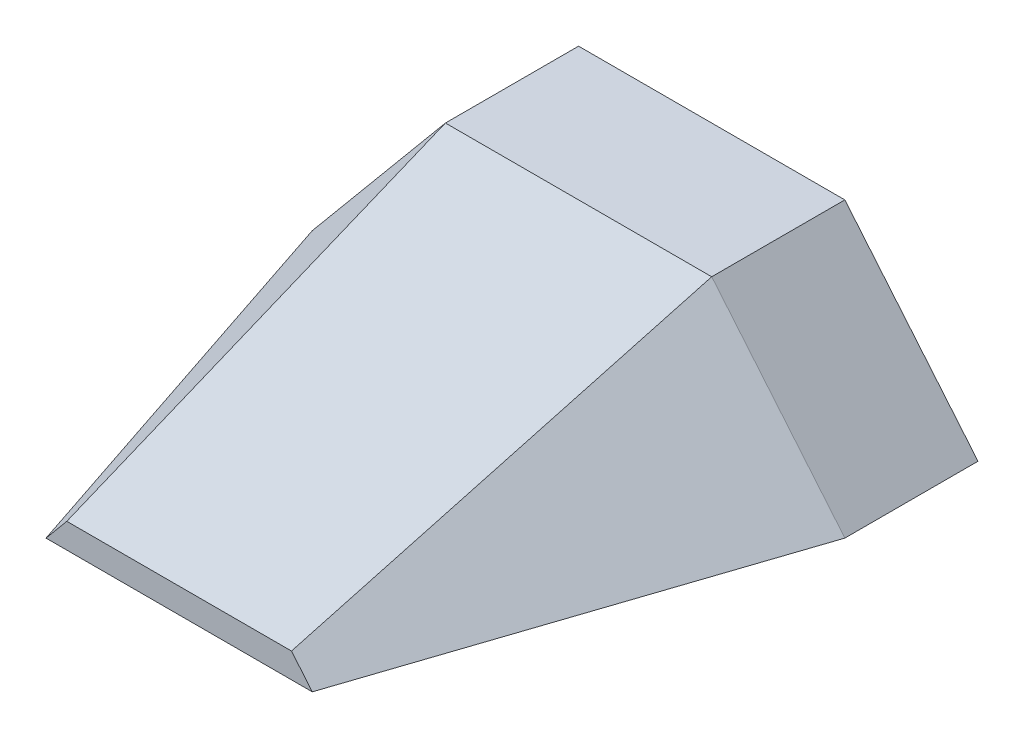
ISO-10303-21;
HEADER;
FILE_DESCRIPTION(('STEP AP214'),'2;1');
FILE_NAME('part.step','',(''),(''),'','','');
FILE_SCHEMA(('AUTOMOTIVE_DESIGN { 1 0 10303 214 1 1 1 1 }'));
ENDSEC;
DATA;
#1=APPLICATION_CONTEXT('core data for automotive mechanical design processes');
#2=APPLICATION_PROTOCOL_DEFINITION('international standard','automotive_design',2000,#1);
#3=PRODUCT_CONTEXT('',#1,'mechanical');
#4=PRODUCT('Part','Part','',(#3));
#5=PRODUCT_RELATED_PRODUCT_CATEGORY('part','',(#4));
#6=PRODUCT_DEFINITION_FORMATION('','',#4);
#7=PRODUCT_DEFINITION_CONTEXT('part definition',#1,'design');
#8=PRODUCT_DEFINITION('design','',#6,#7);
#9=PRODUCT_DEFINITION_SHAPE('','',#8);
#10=(LENGTH_UNIT() NAMED_UNIT(*) SI_UNIT(.MILLI.,.METRE.));
#11=(NAMED_UNIT(*) PLANE_ANGLE_UNIT() SI_UNIT($,.RADIAN.));
#12=(NAMED_UNIT(*) SI_UNIT($,.STERADIAN.) SOLID_ANGLE_UNIT());
#13=UNCERTAINTY_MEASURE_WITH_UNIT(LENGTH_MEASURE(1.E-05),#10,'distance_accuracy_value','');
#14=(GEOMETRIC_REPRESENTATION_CONTEXT(3) GLOBAL_UNCERTAINTY_ASSIGNED_CONTEXT((#13)) GLOBAL_UNIT_ASSIGNED_CONTEXT((#10,
#11,#12)) REPRESENTATION_CONTEXT('',''));
#15=CARTESIAN_POINT('',(0.,0.,0.));
#16=DIRECTION('',(0.,0.,1.));
#17=DIRECTION('',(1.,0.,0.));
#18=AXIS2_PLACEMENT_3D('',#15,#16,#17);
#19=CARTESIAN_POINT('',(16.,0.,8.));
#20=DIRECTION('',(0.,1.,0.));
#21=DIRECTION('',(-1.,0.,0.));
#22=AXIS2_PLACEMENT_3D('',#19,#20,#21);
#23=PLANE('',#22);
#24=DIRECTION('',(1.,0.,0.));
#25=VECTOR('',#24,1.);
#26=CARTESIAN_POINT('',(16.,0.,0.));
#27=LINE('',#26,#25);
#28=CARTESIAN_POINT('',(-16.,0.,0.));
#29=VERTEX_POINT('',#28);
#30=CARTESIAN_POINT('',(16.,0.,0.));
#31=VERTEX_POINT('',#30);
#32=EDGE_CURVE('E121',#29,#31,#27,.T.);
#33=ORIENTED_EDGE('',*,*,#32,.T.);
#34=DIRECTION('',(0.,0.,-1.));
#35=VECTOR('',#34,1.);
#36=CARTESIAN_POINT('',(16.,0.,8.));
#37=LINE('',#36,#35);
#38=CARTESIAN_POINT('',(16.,0.,8.));
#39=VERTEX_POINT('',#38);
#40=EDGE_CURVE('E59',#39,#31,#37,.T.);
#41=ORIENTED_EDGE('',*,*,#40,.F.);
#42=DIRECTION('',(-0.316227766016838,0.,0.948683298050514));
#43=VECTOR('',#42,1.);
#44=CARTESIAN_POINT('',(16.,0.,8.));
#45=LINE('',#44,#43);
#46=CARTESIAN_POINT('',(8.,0.,32.));
#47=VERTEX_POINT('',#46);
#48=EDGE_CURVE('E257',#39,#47,#45,.T.);
#49=ORIENTED_EDGE('',*,*,#48,.T.);
#50=DIRECTION('',(1.,0.,0.));
#51=VECTOR('',#50,1.);
#52=CARTESIAN_POINT('',(-8.,0.,32.));
#53=LINE('',#52,#51);
#54=CARTESIAN_POINT('',(-8.,0.,32.));
#55=VERTEX_POINT('',#54);
#56=EDGE_CURVE('E153',#55,#47,#53,.T.);
#57=ORIENTED_EDGE('',*,*,#56,.F.);
#58=DIRECTION('',(0.316227766016838,0.,0.948683298050514));
#59=VECTOR('',#58,1.);
#60=CARTESIAN_POINT('',(-16.,0.,8.));
#61=LINE('',#60,#59);
#62=CARTESIAN_POINT('',(-16.,0.,8.));
#63=VERTEX_POINT('',#62);
#64=EDGE_CURVE('E202',#63,#55,#61,.T.);
#65=ORIENTED_EDGE('',*,*,#64,.F.);
#66=DIRECTION('',(0.,0.,-1.));
#67=VECTOR('',#66,1.);
#68=CARTESIAN_POINT('',(-16.,0.,8.));
#69=LINE('',#68,#67);
#70=EDGE_CURVE('E12',#63,#29,#69,.T.);
#71=ORIENTED_EDGE('',*,*,#70,.T.);
#72=EDGE_LOOP('',(#33,#41,#49,#57,#65,#71));
#73=FACE_BOUND('',#72,.T.);
#74=DIRECTION('',(1.,0.,0.));
#75=VECTOR('',#74,1.);
#76=CARTESIAN_POINT('',(0.,0.,1.6));
#77=LINE('',#76,#75);
#78=CARTESIAN_POINT('',(-13.9172667530916,0.,1.6));
#79=VERTEX_POINT('',#78);
#80=CARTESIAN_POINT('',(13.9172667530916,0.,1.6));
#81=VERTEX_POINT('',#80);
#82=EDGE_CURVE('E490',#79,#81,#77,.T.);
#83=ORIENTED_EDGE('',*,*,#82,.F.);
#84=DIRECTION('',(0.,0.,-1.));
#85=VECTOR('',#84,1.);
#86=CARTESIAN_POINT('',(-13.9172667530916,0.,8.));
#87=LINE('',#86,#85);
#88=CARTESIAN_POINT('',(-13.9172667530916,0.,7.79839354208649));
#89=VERTEX_POINT('',#88);
#90=EDGE_CURVE('E483',#89,#79,#87,.T.);
#91=ORIENTED_EDGE('',*,*,#90,.F.);
#92=DIRECTION('',(0.316227766016838,0.,0.948683298050514));
#93=VECTOR('',#92,1.);
#94=CARTESIAN_POINT('',(-14.8650581404084,0.,4.95501938013611));
#95=LINE('',#94,#93);
#96=CARTESIAN_POINT('',(-6.38339793378706,0.,30.4));
#97=VERTEX_POINT('',#96);
#98=EDGE_CURVE('E67',#89,#97,#95,.T.);
#99=ORIENTED_EDGE('',*,*,#98,.T.);
#100=DIRECTION('',(1.,0.,0.));
#101=VECTOR('',#100,1.);
#102=CARTESIAN_POINT('',(16.,0.,30.4));
#103=LINE('',#102,#101);
#104=CARTESIAN_POINT('',(6.38339793378706,0.,30.4));
#105=VERTEX_POINT('',#104);
#106=EDGE_CURVE('E500',#97,#105,#103,.T.);
#107=ORIENTED_EDGE('',*,*,#106,.T.);
#108=DIRECTION('',(-0.316227766016838,0.,0.948683298050514));
#109=VECTOR('',#108,1.);
#110=CARTESIAN_POINT('',(14.0650581404084,0.,7.35501938013612));
#111=LINE('',#110,#109);
#112=CARTESIAN_POINT('',(13.9172667530916,0.,7.7983935420865));
#113=VERTEX_POINT('',#112);
#114=EDGE_CURVE('E458',#113,#105,#111,.T.);
#115=ORIENTED_EDGE('',*,*,#114,.F.);
#116=DIRECTION('',(0.,0.,-1.));
#117=VECTOR('',#116,1.);
#118=CARTESIAN_POINT('',(13.9172667530916,0.,8.));
#119=LINE('',#118,#117);
#120=EDGE_CURVE('E467',#113,#81,#119,.T.);
#121=ORIENTED_EDGE('',*,*,#120,.T.);
#122=EDGE_LOOP('',(#83,#91,#99,#107,#115,#121));
#123=FACE_BOUND('',#122,.T.);
#124=ADVANCED_FACE('F49',(#73,#123),#23,.F.);
#125=CARTESIAN_POINT('',(-16.,0.,8.));
#126=DIRECTION('',(0.768221279597376,-0.64018439966448,0.));
#127=DIRECTION('',(0.64018439966448,0.768221279597376,0.));
#128=AXIS2_PLACEMENT_3D('',#125,#126,#127);
#129=PLANE('',#128);
#130=DIRECTION('',(-0.64018439966448,-0.768221279597376,0.));
#131=VECTOR('',#130,1.);
#132=CARTESIAN_POINT('',(-16.,0.,0.));
#133=LINE('',#132,#131);
#134=CARTESIAN_POINT('',(-8.,9.6,0.));
#135=VERTEX_POINT('',#134);
#136=EDGE_CURVE('E131',#135,#29,#133,.T.);
#137=ORIENTED_EDGE('',*,*,#136,.T.);
#138=ORIENTED_EDGE('',*,*,#70,.F.);
#139=DIRECTION('',(0.64018439966448,0.768221279597376,0.));
#140=VECTOR('',#139,1.);
#141=CARTESIAN_POINT('',(-9.44262295081967,7.86885245901639,8.));
#142=LINE('',#141,#140);
#143=CARTESIAN_POINT('',(-8.,9.6,8.));
#144=VERTEX_POINT('',#143);
#145=EDGE_CURVE('E53',#144,#63,#142,.F.);
#146=ORIENTED_EDGE('',*,*,#145,.F.);
#147=DIRECTION('',(0.,0.,-1.));
#148=VECTOR('',#147,1.);
#149=CARTESIAN_POINT('',(-8.,9.6,8.));
#150=LINE('',#149,#148);
#151=EDGE_CURVE('E76',#144,#135,#150,.T.);
#152=ORIENTED_EDGE('',*,*,#151,.T.);
#153=EDGE_LOOP('',(#137,#138,#146,#152));
#154=FACE_BOUND('',#153,.T.);
#155=ADVANCED_FACE('F51',(#154),#129,.F.);
#156=CARTESIAN_POINT('',(8.,9.6,8.));
#157=DIRECTION('',(-0.768221279597375,-0.64018439966448,0.));
#158=DIRECTION('',(0.64018439966448,-0.768221279597375,0.));
#159=AXIS2_PLACEMENT_3D('',#156,#157,#158);
#160=PLANE('',#159);
#161=DIRECTION('',(-0.64018439966448,0.768221279597375,0.));
#162=VECTOR('',#161,1.);
#163=CARTESIAN_POINT('',(8.,9.6,0.));
#164=LINE('',#163,#162);
#165=CARTESIAN_POINT('',(8.,9.6,0.));
#166=VERTEX_POINT('',#165);
#167=EDGE_CURVE('E130',#31,#166,#164,.T.);
#168=ORIENTED_EDGE('',*,*,#167,.T.);
#169=DIRECTION('',(0.,0.,-1.));
#170=VECTOR('',#169,1.);
#171=CARTESIAN_POINT('',(8.,9.6,8.));
#172=LINE('',#171,#170);
#173=CARTESIAN_POINT('',(8.,9.6,8.));
#174=VERTEX_POINT('',#173);
#175=EDGE_CURVE('E135',#174,#166,#172,.T.);
#176=ORIENTED_EDGE('',*,*,#175,.F.);
#177=DIRECTION('',(0.64018439966448,-0.768221279597375,0.));
#178=VECTOR('',#177,1.);
#179=CARTESIAN_POINT('',(9.44262295081967,7.8688524590164,8.));
#180=LINE('',#179,#178);
#181=EDGE_CURVE('E103',#39,#174,#180,.F.);
#182=ORIENTED_EDGE('',*,*,#181,.F.);
#183=ORIENTED_EDGE('',*,*,#40,.T.);
#184=EDGE_LOOP('',(#168,#176,#182,#183));
#185=FACE_BOUND('',#184,.T.);
#186=ADVANCED_FACE('F133',(#185),#160,.F.);
#187=CARTESIAN_POINT('',(-8.,9.6,8.));
#188=DIRECTION('',(0.,-1.,0.));
#189=DIRECTION('',(1.,0.,0.));
#190=AXIS2_PLACEMENT_3D('',#187,#188,#189);
#191=PLANE('',#190);
#192=DIRECTION('',(-1.,0.,0.));
#193=VECTOR('',#192,1.);
#194=CARTESIAN_POINT('',(-8.,9.6,0.));
#195=LINE('',#194,#193);
#196=EDGE_CURVE('E91',#166,#135,#195,.T.);
#197=ORIENTED_EDGE('',*,*,#196,.T.);
#198=ORIENTED_EDGE('',*,*,#151,.F.);
#199=DIRECTION('',(1.,0.,0.));
#200=VECTOR('',#199,1.);
#201=CARTESIAN_POINT('',(0.,9.6,8.));
#202=LINE('',#201,#200);
#203=EDGE_CURVE('E146',#174,#144,#202,.F.);
#204=ORIENTED_EDGE('',*,*,#203,.F.);
#205=ORIENTED_EDGE('',*,*,#175,.T.);
#206=EDGE_LOOP('',(#197,#198,#204,#205));
#207=FACE_BOUND('',#206,.T.);
#208=ADVANCED_FACE('F168',(#207),#191,.F.);
#209=CARTESIAN_POINT('',(0.,0.,0.));
#210=DIRECTION('',(0.,0.,-1.));
#211=DIRECTION('',(-1.,0.,0.));
#212=AXIS2_PLACEMENT_3D('',#209,#210,#211);
#213=PLANE('',#212);
#214=ORIENTED_EDGE('',*,*,#136,.F.);
#215=ORIENTED_EDGE('',*,*,#196,.F.);
#216=ORIENTED_EDGE('',*,*,#167,.F.);
#217=ORIENTED_EDGE('',*,*,#32,.F.);
#218=EDGE_LOOP('',(#214,#215,#216,#217));
#219=FACE_BOUND('',#218,.T.);
#220=ADVANCED_FACE('F137',(#219),#213,.T.);
#221=CARTESIAN_POINT('',(0.,0.,32.));
#222=DIRECTION('',(0.,0.,1.));
#223=DIRECTION('',(1.,0.,0.));
#224=AXIS2_PLACEMENT_3D('',#221,#222,#223);
#225=PLANE('',#224);
#226=DIRECTION('',(-0.64018439966448,0.768221279597376,0.));
#227=VECTOR('',#226,1.);
#228=CARTESIAN_POINT('',(6.75,1.5,32.));
#229=LINE('',#228,#227);
#230=CARTESIAN_POINT('',(6.75,1.5,32.));
#231=VERTEX_POINT('',#230);
#232=EDGE_CURVE('E195',#47,#231,#229,.T.);
#233=ORIENTED_EDGE('',*,*,#232,.T.);
#234=DIRECTION('',(-1.,0.,0.));
#235=VECTOR('',#234,1.);
#236=CARTESIAN_POINT('',(-6.75,1.5,32.));
#237=LINE('',#236,#235);
#238=CARTESIAN_POINT('',(-6.75,1.5,32.));
#239=VERTEX_POINT('',#238);
#240=EDGE_CURVE('E198',#231,#239,#237,.T.);
#241=ORIENTED_EDGE('',*,*,#240,.T.);
#242=DIRECTION('',(-0.64018439966448,-0.768221279597376,0.));
#243=VECTOR('',#242,1.);
#244=CARTESIAN_POINT('',(-8.,0.,32.));
#245=LINE('',#244,#243);
#246=EDGE_CURVE('E203',#239,#55,#245,.T.);
#247=ORIENTED_EDGE('',*,*,#246,.T.);
#248=ORIENTED_EDGE('',*,*,#56,.T.);
#249=EDGE_LOOP('',(#233,#241,#247,#248));
#250=FACE_BOUND('',#249,.T.);
#251=ADVANCED_FACE('F173',(#250),#225,.T.);
#252=CARTESIAN_POINT('',(-10.3384615384615,8.61538461538461,3.44615384615384));
#253=DIRECTION('',(0.744208407535251,-0.620173672946042,-0.248069469178417));
#254=DIRECTION('',(0.64018439966448,0.768221279597376,0.));
#255=AXIS2_PLACEMENT_3D('',#252,#253,#254);
#256=PLANE('',#255);
#257=ORIENTED_EDGE('',*,*,#64,.T.);
#258=ORIENTED_EDGE('',*,*,#246,.F.);
#259=DIRECTION('',(0.0492885769488059,-0.319389978628261,0.946340677417071));
#260=VECTOR('',#259,1.);
#261=CARTESIAN_POINT('',(-8.,9.6,8.));
#262=LINE('',#261,#260);
#263=EDGE_CURVE('E260',#144,#239,#262,.T.);
#264=ORIENTED_EDGE('',*,*,#263,.F.);
#265=ORIENTED_EDGE('',*,*,#145,.T.);
#266=EDGE_LOOP('',(#257,#258,#264,#265));
#267=FACE_BOUND('',#266,.T.);
#268=ADVANCED_FACE('F224',(#267),#256,.F.);
#269=CARTESIAN_POINT('',(0.,11.0422219105064,3.7267498947959));
#270=DIRECTION('',(0.,-0.947492278987199,-0.31977864415818));
#271=DIRECTION('',(0.,0.31977864415818,-0.947492278987199));
#272=AXIS2_PLACEMENT_3D('',#269,#270,#271);
#273=PLANE('',#272);
#274=ORIENTED_EDGE('',*,*,#263,.T.);
#275=ORIENTED_EDGE('',*,*,#240,.F.);
#276=DIRECTION('',(-0.0492885769488056,-0.319389978628261,0.946340677417071));
#277=VECTOR('',#276,1.);
#278=CARTESIAN_POINT('',(8.,9.6,8.));
#279=LINE('',#278,#277);
#280=EDGE_CURVE('E113',#174,#231,#279,.T.);
#281=ORIENTED_EDGE('',*,*,#280,.F.);
#282=ORIENTED_EDGE('',*,*,#203,.T.);
#283=EDGE_LOOP('',(#274,#275,#281,#282));
#284=FACE_BOUND('',#283,.T.);
#285=ADVANCED_FACE('F179',(#284),#273,.F.);
#286=CARTESIAN_POINT('',(10.3384615384615,8.61538461538463,3.44615384615385));
#287=DIRECTION('',(-0.74420840753525,-0.620173672946043,-0.248069469178417));
#288=DIRECTION('',(0.64018439966448,-0.768221279597375,0.));
#289=AXIS2_PLACEMENT_3D('',#286,#287,#288);
#290=PLANE('',#289);
#291=ORIENTED_EDGE('',*,*,#280,.T.);
#292=ORIENTED_EDGE('',*,*,#232,.F.);
#293=ORIENTED_EDGE('',*,*,#48,.F.);
#294=ORIENTED_EDGE('',*,*,#181,.T.);
#295=EDGE_LOOP('',(#291,#292,#293,#294));
#296=FACE_BOUND('',#295,.T.);
#297=ADVANCED_FACE('F174',(#296),#290,.F.);
#298=CARTESIAN_POINT('',(-14.7708459526442,-1.02429503946317,8.));
#299=DIRECTION('',(0.768221279597376,-0.64018439966448,0.));
#300=DIRECTION('',(0.64018439966448,0.768221279597376,0.));
#301=AXIS2_PLACEMENT_3D('',#298,#299,#300);
#302=PLANE('',#301);
#303=DIRECTION('',(-0.64018439966448,-0.768221279597376,0.));
#304=VECTOR('',#303,1.);
#305=CARTESIAN_POINT('',(-8.21346890346388,6.84455741955322,1.6));
#306=LINE('',#305,#304);
#307=CARTESIAN_POINT('',(-7.2506000864249,7.99999999999999,1.6));
#308=VERTEX_POINT('',#307);
#309=EDGE_CURVE('E457',#308,#79,#306,.T.);
#310=ORIENTED_EDGE('',*,*,#309,.F.);
#311=DIRECTION('',(0.,0.,-1.));
#312=VECTOR('',#311,1.);
#313=CARTESIAN_POINT('',(-7.2506000864249,8.,8.));
#314=LINE('',#313,#312);
#315=CARTESIAN_POINT('',(-7.2506000864249,7.99999999999999,7.73727966155575));
#316=VERTEX_POINT('',#315);
#317=EDGE_CURVE('E522',#316,#308,#314,.T.);
#318=ORIENTED_EDGE('',*,*,#317,.F.);
#319=DIRECTION('',(-0.257496237323986,-0.308995484788783,0.915542177151951));
#320=VECTOR('',#319,1.);
#321=CARTESIAN_POINT('',(-5.58232207528539,10.0019336133674,1.80562451083749));
#322=LINE('',#321,#320);
#323=CARTESIAN_POINT('',(-7.26778836532417,7.97937406532087,7.79839354208649));
#324=VERTEX_POINT('',#323);
#325=EDGE_CURVE('E478',#316,#324,#322,.T.);
#326=ORIENTED_EDGE('',*,*,#325,.T.);
#327=DIRECTION('',(-0.64018439966448,-0.768221279597376,0.));
#328=VECTOR('',#327,1.);
#329=CARTESIAN_POINT('',(-8.21346890346387,6.84455741955322,7.79839354208649));
#330=LINE('',#329,#328);
#331=EDGE_CURVE('E471',#324,#89,#330,.T.);
#332=ORIENTED_EDGE('',*,*,#331,.T.);
#333=ORIENTED_EDGE('',*,*,#90,.T.);
#334=EDGE_LOOP('',(#310,#318,#326,#332,#333));
#335=FACE_BOUND('',#334,.T.);
#336=ADVANCED_FACE('F178',(#335),#302,.T.);
#337=CARTESIAN_POINT('',(6.7708459526442,8.57570496053683,8.));
#338=DIRECTION('',(-0.768221279597375,-0.64018439966448,0.));
#339=DIRECTION('',(0.64018439966448,-0.768221279597375,0.));
#340=AXIS2_PLACEMENT_3D('',#337,#338,#339);
#341=PLANE('',#340);
#342=DIRECTION('',(-0.64018439966448,0.768221279597376,0.));
#343=VECTOR('',#342,1.);
#344=CARTESIAN_POINT('',(8.21346890346387,6.84455741955323,1.6));
#345=LINE('',#344,#343);
#346=CARTESIAN_POINT('',(7.25060008642489,8.,1.6));
#347=VERTEX_POINT('',#346);
#348=EDGE_CURVE('E494',#81,#347,#345,.T.);
#349=ORIENTED_EDGE('',*,*,#348,.F.);
#350=ORIENTED_EDGE('',*,*,#120,.F.);
#351=DIRECTION('',(-0.64018439966448,0.768221279597375,0.));
#352=VECTOR('',#351,1.);
#353=CARTESIAN_POINT('',(8.21346890346386,6.84455741955323,7.7983935420865));
#354=LINE('',#353,#352);
#355=CARTESIAN_POINT('',(7.26778836532417,7.97937406532087,7.7983935420865));
#356=VERTEX_POINT('',#355);
#357=EDGE_CURVE('E446',#113,#356,#354,.T.);
#358=ORIENTED_EDGE('',*,*,#357,.T.);
#359=DIRECTION('',(0.257496237323986,-0.308995484788783,0.915542177151951));
#360=VECTOR('',#359,1.);
#361=CARTESIAN_POINT('',(7.23492022203893,8.01881583726316,7.68152903262787));
#362=LINE('',#361,#360);
#363=CARTESIAN_POINT('',(7.25060008642489,8.,7.73727966155574));
#364=VERTEX_POINT('',#363);
#365=EDGE_CURVE('E464',#364,#356,#362,.T.);
#366=ORIENTED_EDGE('',*,*,#365,.F.);
#367=DIRECTION('',(0.,0.,-1.));
#368=VECTOR('',#367,1.);
#369=CARTESIAN_POINT('',(7.25060008642489,8.,8.));
#370=LINE('',#369,#368);
#371=EDGE_CURVE('E497',#364,#347,#370,.T.);
#372=ORIENTED_EDGE('',*,*,#371,.T.);
#373=EDGE_LOOP('',(#349,#350,#358,#366,#372));
#374=FACE_BOUND('',#373,.T.);
#375=ADVANCED_FACE('F343',(#374),#341,.T.);
#376=CARTESIAN_POINT('',(-8.,7.99999999999999,8.));
#377=DIRECTION('',(0.,-1.,0.));
#378=DIRECTION('',(1.,0.,0.));
#379=AXIS2_PLACEMENT_3D('',#376,#377,#378);
#380=PLANE('',#379);
#381=DIRECTION('',(-1.,0.,0.));
#382=VECTOR('',#381,1.);
#383=CARTESIAN_POINT('',(0.,8.,1.6));
#384=LINE('',#383,#382);
#385=EDGE_CURVE('E519',#347,#308,#384,.T.);
#386=ORIENTED_EDGE('',*,*,#385,.F.);
#387=ORIENTED_EDGE('',*,*,#371,.F.);
#388=DIRECTION('',(-1.,0.,0.));
#389=VECTOR('',#388,1.);
#390=CARTESIAN_POINT('',(0.,8.,7.73727966155574));
#391=LINE('',#390,#389);
#392=EDGE_CURVE('E470',#364,#316,#391,.T.);
#393=ORIENTED_EDGE('',*,*,#392,.T.);
#394=ORIENTED_EDGE('',*,*,#317,.T.);
#395=EDGE_LOOP('',(#386,#387,#393,#394));
#396=FACE_BOUND('',#395,.T.);
#397=ADVANCED_FACE('F351',(#396),#380,.T.);
#398=CARTESIAN_POINT('',(0.,0.,1.6));
#399=DIRECTION('',(0.,0.,-1.));
#400=DIRECTION('',(-1.,0.,0.));
#401=AXIS2_PLACEMENT_3D('',#398,#399,#400);
#402=PLANE('',#401);
#403=ORIENTED_EDGE('',*,*,#309,.T.);
#404=ORIENTED_EDGE('',*,*,#82,.T.);
#405=ORIENTED_EDGE('',*,*,#348,.T.);
#406=ORIENTED_EDGE('',*,*,#385,.T.);
#407=EDGE_LOOP('',(#403,#404,#405,#406));
#408=FACE_BOUND('',#407,.T.);
#409=ADVANCED_FACE('F359',(#408),#402,.F.);
#410=CARTESIAN_POINT('',(0.,0.,30.4));
#411=DIRECTION('',(0.,0.,1.));
#412=DIRECTION('',(1.,0.,0.));
#413=AXIS2_PLACEMENT_3D('',#410,#411,#412);
#414=PLANE('',#413);
#415=DIRECTION('',(-0.64018439966448,0.768221279597375,0.));
#416=VECTOR('',#415,1.);
#417=CARTESIAN_POINT('',(3.76725123961203,3.13937603301003,30.4));
#418=LINE('',#417,#416);
#419=CARTESIAN_POINT('',(6.09062136230784,0.351331885775069,30.4));
#420=VERTEX_POINT('',#419);
#421=EDGE_CURVE('E450',#105,#420,#418,.T.);
#422=ORIENTED_EDGE('',*,*,#421,.F.);
#423=ORIENTED_EDGE('',*,*,#106,.F.);
#424=DIRECTION('',(-0.64018439966448,-0.768221279597376,0.));
#425=VECTOR('',#424,1.);
#426=CARTESIAN_POINT('',(-3.76725123961204,3.13937603301003,30.4));
#427=LINE('',#426,#425);
#428=CARTESIAN_POINT('',(-6.09062136230784,0.351331885775069,30.4));
#429=VERTEX_POINT('',#428);
#430=EDGE_CURVE('E503',#429,#97,#427,.T.);
#431=ORIENTED_EDGE('',*,*,#430,.F.);
#432=DIRECTION('',(-1.,0.,0.));
#433=VECTOR('',#432,1.);
#434=CARTESIAN_POINT('',(0.,0.351331885775069,30.4));
#435=LINE('',#434,#433);
#436=EDGE_CURVE('E508',#420,#429,#435,.T.);
#437=ORIENTED_EDGE('',*,*,#436,.F.);
#438=EDGE_LOOP('',(#422,#423,#431,#437));
#439=FACE_BOUND('',#438,.T.);
#440=ADVANCED_FACE('F367',(#439),#414,.F.);
#441=CARTESIAN_POINT('',(-9.14772808640514,7.62310673867095,3.04924269546838));
#442=DIRECTION('',(0.744208407535251,-0.620173672946042,-0.248069469178417));
#443=DIRECTION('',(0.64018439966448,0.768221279597376,0.));
#444=AXIS2_PLACEMENT_3D('',#441,#442,#443);
#445=PLANE('',#444);
#446=ORIENTED_EDGE('',*,*,#98,.F.);
#447=ORIENTED_EDGE('',*,*,#331,.F.);
#448=DIRECTION('',(0.0492885769488058,-0.319389978628261,0.946340677417071));
#449=VECTOR('',#448,1.);
#450=CARTESIAN_POINT('',(-7.48826533616854,9.4080648363924,3.56523570187455));
#451=LINE('',#450,#449);
#452=EDGE_CURVE('E499',#324,#429,#451,.T.);
#453=ORIENTED_EDGE('',*,*,#452,.T.);
#454=ORIENTED_EDGE('',*,*,#430,.T.);
#455=EDGE_LOOP('',(#446,#447,#453,#454));
#456=FACE_BOUND('',#455,.T.);
#457=ADVANCED_FACE('F375',(#456),#445,.T.);
#458=CARTESIAN_POINT('',(0.,9.52623426412686,3.21510406414281));
#459=DIRECTION('',(0.,-0.947492278987199,-0.31977864415818));
#460=DIRECTION('',(0.,0.31977864415818,-0.947492278987199));
#461=AXIS2_PLACEMENT_3D('',#458,#459,#460);
#462=PLANE('',#461);
#463=ORIENTED_EDGE('',*,*,#452,.F.);
#464=ORIENTED_EDGE('',*,*,#325,.F.);
#465=ORIENTED_EDGE('',*,*,#392,.F.);
#466=ORIENTED_EDGE('',*,*,#365,.T.);
#467=DIRECTION('',(-0.0492885769488058,-0.319389978628261,0.946340677417071));
#468=VECTOR('',#467,1.);
#469=CARTESIAN_POINT('',(7.48826533616854,9.4080648363924,3.56523570187455));
#470=LINE('',#469,#468);
#471=EDGE_CURVE('E442',#356,#420,#470,.T.);
#472=ORIENTED_EDGE('',*,*,#471,.T.);
#473=ORIENTED_EDGE('',*,*,#436,.T.);
#474=EDGE_LOOP('',(#463,#464,#465,#466,#472,#473));
#475=FACE_BOUND('',#474,.T.);
#476=ADVANCED_FACE('F383',(#475),#462,.T.);
#477=CARTESIAN_POINT('',(9.14772808640513,7.62310673867096,3.04924269546838));
#478=DIRECTION('',(-0.74420840753525,-0.620173672946043,-0.248069469178417));
#479=DIRECTION('',(0.64018439966448,-0.768221279597375,0.));
#480=AXIS2_PLACEMENT_3D('',#477,#478,#479);
#481=PLANE('',#480);
#482=ORIENTED_EDGE('',*,*,#471,.F.);
#483=ORIENTED_EDGE('',*,*,#357,.F.);
#484=ORIENTED_EDGE('',*,*,#114,.T.);
#485=ORIENTED_EDGE('',*,*,#421,.T.);
#486=EDGE_LOOP('',(#482,#483,#484,#485));
#487=FACE_BOUND('',#486,.T.);
#488=ADVANCED_FACE('F225',(#487),#481,.T.);
#489=CLOSED_SHELL('',(#124,#155,#186,#208,#220,#251,#268,#285,#297,#336,#375,#397,#409,#440,
#457,#476,#488));
#490=MANIFOLD_SOLID_BREP('B2',#489);
#491=ADVANCED_BREP_SHAPE_REPRESENTATION('',(#18,#490),#14);
#492=SHAPE_DEFINITION_REPRESENTATION(#9,#491);
ENDSEC;
END-ISO-10303-21;
